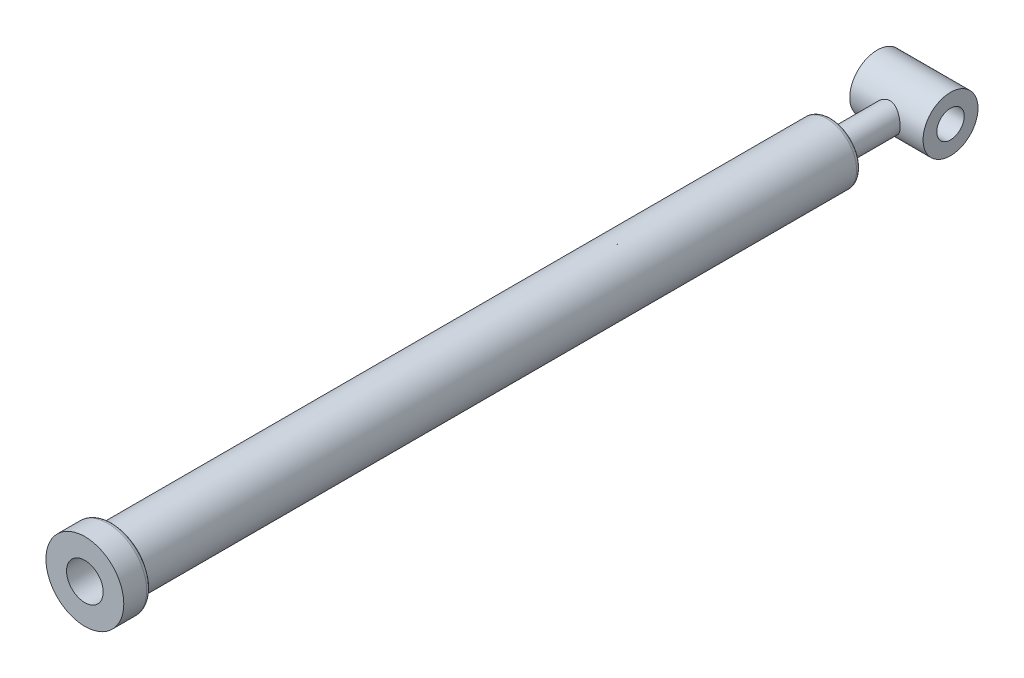
ISO-10303-21;
HEADER;
FILE_DESCRIPTION(('STEP AP214'),'2;1');
FILE_NAME('part.step','',(''),(''),'','','');
FILE_SCHEMA(('AUTOMOTIVE_DESIGN { 1 0 10303 214 1 1 1 1 }'));
ENDSEC;
DATA;
#1=APPLICATION_CONTEXT('core data for automotive mechanical design processes');
#2=APPLICATION_PROTOCOL_DEFINITION('international standard','automotive_design',2000,#1);
#3=PRODUCT_CONTEXT('',#1,'mechanical');
#4=PRODUCT('Part','Part','',(#3));
#5=PRODUCT_RELATED_PRODUCT_CATEGORY('part','',(#4));
#6=PRODUCT_DEFINITION_FORMATION('','',#4);
#7=PRODUCT_DEFINITION_CONTEXT('part definition',#1,'design');
#8=PRODUCT_DEFINITION('design','',#6,#7);
#9=PRODUCT_DEFINITION_SHAPE('','',#8);
#10=(LENGTH_UNIT() NAMED_UNIT(*) SI_UNIT(.MILLI.,.METRE.));
#11=(NAMED_UNIT(*) PLANE_ANGLE_UNIT() SI_UNIT($,.RADIAN.));
#12=(NAMED_UNIT(*) SI_UNIT($,.STERADIAN.) SOLID_ANGLE_UNIT());
#13=UNCERTAINTY_MEASURE_WITH_UNIT(LENGTH_MEASURE(1.E-05),#10,'distance_accuracy_value','');
#14=(GEOMETRIC_REPRESENTATION_CONTEXT(3) GLOBAL_UNCERTAINTY_ASSIGNED_CONTEXT((#13)) GLOBAL_UNIT_ASSIGNED_CONTEXT((#10,
#11,#12)) REPRESENTATION_CONTEXT('',''));
#15=CARTESIAN_POINT('',(0.,0.,0.));
#16=DIRECTION('',(0.,0.,1.));
#17=DIRECTION('',(1.,0.,0.));
#18=AXIS2_PLACEMENT_3D('',#15,#16,#17);
#19=CARTESIAN_POINT('',(0.,0.,-880.));
#20=DIRECTION('',(0.,0.,1.));
#21=DIRECTION('',(1.,0.,0.));
#22=AXIS2_PLACEMENT_3D('',#19,#20,#21);
#23=CYLINDRICAL_SURFACE('',#22,15.);
#24=CARTESIAN_POINT('',(0.,0.,-820.));
#25=DIRECTION('',(0.,0.,-1.));
#26=DIRECTION('',(-1.,0.,0.));
#27=AXIS2_PLACEMENT_3D('',#24,#25,#26);
#28=CIRCLE('',#27,15.);
#29=CARTESIAN_POINT('',(-15.,0.,-820.));
#30=VERTEX_POINT('',#29);
#31=EDGE_CURVE('E50',#30,#30,#28,.T.);
#32=ORIENTED_EDGE('',*,*,#31,.T.);
#33=EDGE_LOOP('',(#32));
#34=FACE_BOUND('',#33,.T.);
#35=CARTESIAN_POINT('',(15.,0.,-875.));
#36=CARTESIAN_POINT('',(14.9999986967893,-0.394466621474774,-875.000001198443));
#37=CARTESIAN_POINT('',(14.9844217290986,-0.788960822893598,-875.007798374441));
#38=CARTESIAN_POINT('',(14.9222912626951,-1.57504384672489,-875.038790696874));
#39=CARTESIAN_POINT('',(14.8757242881962,-1.96663133023565,-875.061992541911));
#40=CARTESIAN_POINT('',(14.752062134402,-2.74444839066597,-875.123245665513));
#41=CARTESIAN_POINT('',(14.674915671778,-3.13066783309047,-875.161321887591));
#42=CARTESIAN_POINT('',(14.4909926788045,-3.89427274204147,-875.251345482788));
#43=CARTESIAN_POINT('',(14.3842191117729,-4.27165908796738,-875.303291468628));
#44=CARTESIAN_POINT('',(14.1426464967422,-5.01370255233915,-875.419545464834));
#45=CARTESIAN_POINT('',(14.0079586988167,-5.37840368544458,-875.483804328683));
#46=CARTESIAN_POINT('',(13.7115835174738,-6.09447648128182,-875.623301187505));
#47=CARTESIAN_POINT('',(13.5498955527415,-6.44584785682342,-875.698539418861));
#48=CARTESIAN_POINT('',(13.2009461452605,-7.13327098283041,-875.858261390877));
#49=CARTESIAN_POINT('',(13.0136941461367,-7.4693283295993,-875.942741715132));
#50=CARTESIAN_POINT('',(12.6148696065897,-8.12479620523715,-876.119159593015));
#51=CARTESIAN_POINT('',(12.4032874777652,-8.44420009848104,-876.211100082431));
#52=CARTESIAN_POINT('',(11.9437431549207,-9.08356730455507,-876.406169485422));
#53=CARTESIAN_POINT('',(11.6943566948693,-9.40240338911198,-876.509638755958));
#54=CARTESIAN_POINT('',(11.1713323045258,-10.0182110858624,-876.720301058942));
#55=CARTESIAN_POINT('',(10.8976929878613,-10.3151814463611,-876.827494304051));
#56=CARTESIAN_POINT('',(10.32744213221,-10.8860835918351,-877.043134053405));
#57=CARTESIAN_POINT('',(10.0308163772597,-11.1600008976787,-877.151581297343));
#58=CARTESIAN_POINT('',(9.41609706949255,-11.6833254232374,-877.367048472574));
#59=CARTESIAN_POINT('',(9.09799950074795,-11.9327280363632,-877.474068132354));
#60=CARTESIAN_POINT('',(8.41621019135655,-12.424066666325,-877.692119687857));
#61=CARTESIAN_POINT('',(8.05089693128164,-12.6639084928373,-877.802814953086));
#62=CARTESIAN_POINT('',(7.29906225682786,-13.1116371457317,-878.01581142987));
#63=CARTESIAN_POINT('',(6.91254992484988,-13.3195375140209,-878.118116190041));
#64=CARTESIAN_POINT('',(6.12045119528939,-13.7015816677248,-878.310817756053));
#65=CARTESIAN_POINT('',(5.71487061752195,-13.8757356708103,-878.40121816361));
#66=CARTESIAN_POINT('',(4.88717106989482,-14.1884178363296,-878.566685065391));
#67=CARTESIAN_POINT('',(4.46505393858207,-14.3269499463523,-878.641753258529));
#68=CARTESIAN_POINT('',(3.63312743966091,-14.5593818816456,-878.769465636118));
#69=CARTESIAN_POINT('',(3.22409061692207,-14.6554546162323,-878.823181991672));
#70=CARTESIAN_POINT('',(2.3974253026042,-14.8131483158836,-878.912093372582));
#71=CARTESIAN_POINT('',(1.97979717934038,-14.874770754679,-878.947289190215));
#72=CARTESIAN_POINT('',(1.1399780978413,-14.9625716596024,-878.997615020556));
#73=CARTESIAN_POINT('',(0.717791304375857,-14.9887801055065,-879.012762005415));
#74=CARTESIAN_POINT('',(-0.127503752153197,-15.0054120092055,-879.022361014937));
#75=CARTESIAN_POINT('',(-0.550611923450829,-14.9958388811994,-879.016815014078));
#76=CARTESIAN_POINT('',(-1.34318604493256,-14.9443693637688,-878.987185469988));
#77=CARTESIAN_POINT('',(-1.7130074967434,-14.9064815133301,-878.965401642622));
#78=CARTESIAN_POINT('',(-2.44761394651885,-14.8036048078167,-878.90676729953));
#79=CARTESIAN_POINT('',(-2.81239941379462,-14.7386184959446,-878.869918197694));
#80=CARTESIAN_POINT('',(-3.53465011425935,-14.5822778462236,-878.782349877417));
#81=CARTESIAN_POINT('',(-3.8921134894694,-14.490916902454,-878.731627184297));
#82=CARTESIAN_POINT('',(-4.5975509702241,-14.2827793732036,-878.617879915435));
#83=CARTESIAN_POINT('',(-4.94552456919406,-14.1660014339124,-878.554854684428));
#84=CARTESIAN_POINT('',(-5.63806138553526,-13.9051185945145,-878.416735657268));
#85=CARTESIAN_POINT('',(-5.98236177926314,-13.7604466030275,-878.341397479624));
#86=CARTESIAN_POINT('',(-6.65764881287019,-13.4467240006949,-878.181786349803));
#87=CARTESIAN_POINT('',(-6.9886306367092,-13.2776646708395,-878.097510204973));
#88=CARTESIAN_POINT('',(-7.63583954119808,-12.9163207460711,-877.922168121219));
#89=CARTESIAN_POINT('',(-7.95206429387355,-12.724032503779,-877.831101116863));
#90=CARTESIAN_POINT('',(-8.56852275615349,-12.3173373374607,-877.644319137144));
#91=CARTESIAN_POINT('',(-8.86875518007752,-12.1029286391493,-877.548603789262));
#92=CARTESIAN_POINT('',(-9.48921356105551,-11.6244221009996,-877.342288154575));
#93=CARTESIAN_POINT('',(-9.80713018813409,-11.357472454083,-877.23134228918));
#94=CARTESIAN_POINT('',(-10.4195910602954,-10.7983337273758,-877.009171948651));
#95=CARTESIAN_POINT('',(-10.7141433900476,-10.5061534517949,-876.897947583749));
#96=CARTESIAN_POINT('',(-11.2787205781467,-9.89761910582897,-876.677890344788));
#97=CARTESIAN_POINT('',(-11.5487236024523,-9.58124396820905,-876.569059663621));
#98=CARTESIAN_POINT('',(-12.0621805278786,-8.92619254193717,-876.356648454252));
#99=CARTESIAN_POINT('',(-12.3056450163623,-8.58752523371366,-876.253065841263));
#100=CARTESIAN_POINT('',(-12.7751937974681,-7.87309152384946,-876.049027950798));
#101=CARTESIAN_POINT('',(-12.999931268877,-7.49633062281164,-875.94894596163));
#102=CARTESIAN_POINT('',(-13.4165538554255,-6.72229496746225,-875.760139769321));
#103=CARTESIAN_POINT('',(-13.608437440683,-6.32501925897374,-875.671416095143));
#104=CARTESIAN_POINT('',(-13.9571914545699,-5.51289034160744,-875.507976152198));
#105=CARTESIAN_POINT('',(-14.1140841452216,-5.09804850978522,-875.433250982128));
#106=CARTESIAN_POINT('',(-14.391076168471,-4.25373396764104,-875.300028469866));
#107=CARTESIAN_POINT('',(-14.5111797336915,-3.82426294674312,-875.241529260936));
#108=CARTESIAN_POINT('',(-14.7045987917793,-2.99040123124789,-875.146713024642));
#109=CARTESIAN_POINT('',(-14.780965864728,-2.58687987737183,-875.108959937918));
#110=CARTESIAN_POINT('',(-14.9004227368483,-1.77375891598894,-875.049709617986));
#111=CARTESIAN_POINT('',(-14.9435143460633,-1.36415964033065,-875.028211500579));
#112=CARTESIAN_POINT('',(-14.9958394822899,-0.542432179601619,-875.002088586177));
#113=CARTESIAN_POINT('',(-15.0050865466642,-0.130305071717037,-874.997457042783));
#114=CARTESIAN_POINT('',(-14.9896332143828,0.693142933067775,-875.005182902425));
#115=CARTESIAN_POINT('',(-14.9649343201033,1.10446386484084,-875.017539553599));
#116=CARTESIAN_POINT('',(-14.8851569218173,1.89104365716466,-875.057274299687));
#117=CARTESIAN_POINT('',(-14.8325856924447,2.26662317638414,-875.083411784036));
#118=CARTESIAN_POINT('',(-14.6994449555599,3.01155508953995,-875.149198828482));
#119=CARTESIAN_POINT('',(-14.6188772495211,3.38090788254089,-875.188847519177));
#120=CARTESIAN_POINT('',(-14.4305792041858,4.11102643115709,-875.280732355606));
#121=CARTESIAN_POINT('',(-14.322847354219,4.47179170797618,-875.332969201392));
#122=CARTESIAN_POINT('',(-14.0812572947496,5.18257720416893,-875.448848110263));
#123=CARTESIAN_POINT('',(-13.9473979874992,5.53259697135359,-875.512490652549));
#124=CARTESIAN_POINT('',(-13.6505393721982,6.22979935488015,-875.651753782206));
#125=CARTESIAN_POINT('',(-13.4868176517073,6.576616120173,-875.727664302393));
#126=CARTESIAN_POINT('',(-13.1343016754682,7.25508680349727,-875.88839960015));
#127=CARTESIAN_POINT('',(-12.9455071994249,7.58674058826881,-875.973224456043));
#128=CARTESIAN_POINT('',(-12.5441531585986,8.23341158684491,-876.149985850757));
#129=CARTESIAN_POINT('',(-12.3315897999932,8.54842613296244,-876.241923524154));
#130=CARTESIAN_POINT('',(-11.8839483671782,9.16054648853287,-876.431012285166));
#131=CARTESIAN_POINT('',(-11.6488615394066,9.45764526147817,-876.528165393215));
#132=CARTESIAN_POINT('',(-11.1333715012893,10.060839107335,-876.735341464201));
#133=CARTESIAN_POINT('',(-10.8507851186195,10.3649587307601,-876.845692143983));
#134=CARTESIAN_POINT('',(-10.2616154855625,10.9485707923032,-877.06746929941));
#135=CARTESIAN_POINT('',(-9.9550311697726,11.2280621358615,-877.178895822626));
#136=CARTESIAN_POINT('',(-9.31919419442999,11.761157874002,-877.400027289832));
#137=CARTESIAN_POINT('',(-8.98992792709478,12.0147464980315,-877.50973115101));
#138=CARTESIAN_POINT('',(-8.31037887445767,12.4944228999317,-877.724397948994));
#139=CARTESIAN_POINT('',(-7.96009249191951,12.7205059505332,-877.829360068912));
#140=CARTESIAN_POINT('',(-7.22261605950783,13.1539172060939,-878.036414537209));
#141=CARTESIAN_POINT('',(-6.83445930863627,13.3597919511091,-878.138116937488));
#142=CARTESIAN_POINT('',(-6.03927850598328,13.737567232961,-878.329340387484));
#143=CARTESIAN_POINT('',(-5.63226376216402,13.9094843147169,-878.418867362678));
#144=CARTESIAN_POINT('',(-4.80217565091482,14.2174151642657,-878.582288068273));
#145=CARTESIAN_POINT('',(-4.37911544662186,14.353457663537,-878.656194299646));
#146=CARTESIAN_POINT('',(-3.51992505793521,14.5879514095295,-878.78531598748));
#147=CARTESIAN_POINT('',(-3.08379690851378,14.6864084766722,-878.840534337767));
#148=CARTESIAN_POINT('',(-2.24471283239244,14.8366134509912,-878.925460869571));
#149=CARTESIAN_POINT('',(-1.84259137531863,14.8919378625023,-878.957109030588));
#150=CARTESIAN_POINT('',(-1.0341590037221,14.9698153891526,-879.0017947784));
#151=CARTESIAN_POINT('',(-0.627848376009428,14.9923707330054,-879.014833630864));
#152=CARTESIAN_POINT('',(0.185270351507968,15.0043645010929,-879.021757365319));
#153=CARTESIAN_POINT('',(0.592078211651152,14.9938151743778,-879.015649331845));
#154=CARTESIAN_POINT('',(1.40275816467971,14.9397884815991,-878.984549012312));
#155=CARTESIAN_POINT('',(1.80663037706581,14.8963124635393,-878.959557499333));
#156=CARTESIAN_POINT('',(2.56967168244059,14.782795841076,-878.894967278986));
#157=CARTESIAN_POINT('',(2.92942204471818,14.7156934571528,-878.856994150101));
#158=CARTESIAN_POINT('',(3.64159381579529,14.5558242789108,-878.767646667704));
#159=CARTESIAN_POINT('',(3.99401275857395,14.4630489945772,-878.716267881271));
#160=CARTESIAN_POINT('',(4.68939648000362,14.2527724980854,-878.601651711384));
#161=CARTESIAN_POINT('',(5.0323611460618,14.1352709916016,-878.538414186773));
#162=CARTESIAN_POINT('',(5.70716431681701,13.8765585244577,-878.401832636467));
#163=CARTESIAN_POINT('',(6.0390017228925,13.7353452308956,-878.328487616466));
#164=CARTESIAN_POINT('',(6.71194905721808,13.4200195538921,-878.16836954442));
#165=CARTESIAN_POINT('',(7.05218633738287,13.2443351386714,-878.081025622915));
#166=CARTESIAN_POINT('',(7.71683729888767,12.8684192321827,-877.899310742732));
#167=CARTESIAN_POINT('',(8.04125049766908,12.6681869929773,-877.804939569978));
#168=CARTESIAN_POINT('',(8.67307599887717,12.2442855818538,-877.611466647555));
#169=CARTESIAN_POINT('',(8.9804818359264,12.0206075892618,-877.512363125188));
#170=CARTESIAN_POINT('',(9.57700095794095,11.5509819278367,-877.311734819274));
#171=CARTESIAN_POINT('',(9.86611149224955,11.3050309237573,-877.210209674785));
#172=CARTESIAN_POINT('',(10.4588881043877,10.7607009160988,-876.994588016576));
#173=CARTESIAN_POINT('',(10.7600384098886,10.4595848725634,-876.880466375821));
#174=CARTESIAN_POINT('',(11.3360350079751,9.83237263592984,-876.655062843985));
#175=CARTESIAN_POINT('',(11.6108894699081,9.50628425805799,-876.543780078878));
#176=CARTESIAN_POINT('',(12.1328673274452,8.83040064495091,-876.326840554529));
#177=CARTESIAN_POINT('',(12.3799686513199,8.48058689086185,-876.221188307768));
#178=CARTESIAN_POINT('',(12.8443186951047,7.75934315416603,-876.018404213272));
#179=CARTESIAN_POINT('',(13.0615691351246,7.38791441884538,-875.921271874707));
#180=CARTESIAN_POINT('',(13.4657554418474,6.62283359834588,-875.737499586337));
#181=CARTESIAN_POINT('',(13.652463307469,6.22904153096558,-875.650939674485));
#182=CARTESIAN_POINT('',(13.9917304392215,5.42422205013374,-875.491593102566));
#183=CARTESIAN_POINT('',(14.1442848128173,5.01319217734313,-875.418808416049));
#184=CARTESIAN_POINT('',(14.4130312534336,4.17809175418138,-875.289368363161));
#185=CARTESIAN_POINT('',(14.52931393542,3.75405665560561,-875.232672834932));
#186=CARTESIAN_POINT('',(14.7244141315277,2.89570983328148,-875.136960690795));
#187=CARTESIAN_POINT('',(14.8032545313493,2.46140455781254,-875.097933276359));
#188=CARTESIAN_POINT('',(14.9084233559045,1.68912528485808,-875.04570850057));
#189=CARTESIAN_POINT('',(14.9427351996439,1.35247752005866,-875.028597786956));
#190=CARTESIAN_POINT('',(14.9885243961843,0.67722664728,-875.005742865413));
#191=CARTESIAN_POINT('',(15.0000011187201,0.338623485589112,-874.999998971216));
#192=CARTESIAN_POINT('',(15.,0.,-875.));
#193=B_SPLINE_CURVE_WITH_KNOTS('',3,(#35,#36,#37,#38,#39,#40,#41,#42,#43,#44,#45,#46,#47,#48,
#49,#50,#51,#52,#53,#54,#55,#56,#57,#58,#59,#60,#61,#62,#63,#64,#65,#66,#67,#68,#69,#70,#71,#72,
#73,#74,#75,#76,#77,#78,#79,#80,#81,#82,#83,#84,#85,#86,#87,#88,#89,#90,#91,#92,#93,#94,#95,#96,
#97,#98,#99,#100,#101,#102,#103,#104,#105,#106,#107,#108,#109,#110,#111,#112,#113,#114,#115,
#116,#117,#118,#119,#120,#121,#122,#123,#124,#125,#126,#127,#128,#129,#130,#131,#132,#133,#134,
#135,#136,#137,#138,#139,#140,#141,#142,#143,#144,#145,#146,#147,#148,#149,#150,#151,#152,#153,
#154,#155,#156,#157,#158,#159,#160,#161,#162,#163,#164,#165,#166,#167,#168,#169,#170,#171,#172,
#173,#174,#175,#176,#177,#178,#179,#180,#181,#182,#183,#184,#185,#186,#187,#188,#189,#190,#191,
#192),.UNSPECIFIED.,.T.,.F.,(4,2,2,2,2,2,2,2,2,2,2,2,2,2,2,2,2,2,2,2,2,2,2,2,2,2,2,2,2,2,2,2,2,
2,2,2,2,2,2,2,2,2,2,2,2,2,2,2,2,2,2,2,2,2,2,2,2,2,2,2,2,2,2,2,2,2,2,2,2,2,2,2,2,2,2,2,2,2,4),
(0.,1.1830658838765,2.36664655205927,3.55222059958419,4.73767610811696,5.91849492154762,
7.09933916134024,8.27974835920213,9.46062435602728,10.7126941080732,11.9648354787241,
13.2177575130875,14.4709145374422,15.821667201721,17.1718456109054,18.521614574237,
19.8712338927467,21.1401798733571,22.4090715662491,23.6768884023223,24.9445842691984,
26.0604534443427,27.1762179182402,28.2922620948529,29.4083657309785,30.550157382565,
31.6923582661887,32.8347387306652,33.9772108970053,35.2649000045823,36.5521415758273,
37.8405170382692,39.1283766165387,40.4765138704575,41.824713885002,43.1720536807209,
44.519238405488,45.7548292237563,46.9903528264139,48.2253821822106,49.4603568799793,
50.5994583371908,51.7384865108584,52.8775780428886,54.0167174442702,55.1883567290371,
56.3600063087792,57.5318431666801,58.7041373111916,59.9914055352965,61.2787309408957,
62.5668355046821,63.8551611378706,65.2063513889893,66.5568816778175,67.9063270370393,
69.2555633384068,70.4752824018563,71.6949185050053,72.9141033841497,74.1332383531126,
75.2357784731185,76.3386836391977,77.4416019343193,78.5446288045349,79.7216927437009,
80.8987925552603,82.0763368112874,83.2540576898123,84.5752168212047,85.8959641652359,
87.217754555028,88.5394687467831,89.8706389488175,91.2019997209938,92.5300073067729,
93.8572021316087,94.872757858524,95.8883416150965),.UNSPECIFIED.);
#194=CARTESIAN_POINT('',(15.,0.,-875.));
#195=VERTEX_POINT('',#194);
#196=EDGE_CURVE('E73',#195,#195,#193,.T.);
#197=ORIENTED_EDGE('',*,*,#196,.F.);
#198=EDGE_LOOP('',(#197));
#199=FACE_BOUND('',#198,.T.);
#200=ADVANCED_FACE('F41',(#34,#199),#23,.T.);
#201=CARTESIAN_POINT('',(0.,0.,-30.));
#202=DIRECTION('',(0.,0.,1.));
#203=DIRECTION('',(1.,0.,0.));
#204=AXIS2_PLACEMENT_3D('',#201,#202,#203);
#205=CYLINDRICAL_SURFACE('',#204,42.5);
#206=CARTESIAN_POINT('',(0.,0.,-25.));
#207=DIRECTION('',(0.,0.,1.));
#208=DIRECTION('',(1.,0.,0.));
#209=AXIS2_PLACEMENT_3D('',#206,#207,#208);
#210=CIRCLE('',#209,42.5);
#211=CARTESIAN_POINT('',(42.5,0.,-25.));
#212=VERTEX_POINT('',#211);
#213=EDGE_CURVE('E10',#212,#212,#210,.T.);
#214=ORIENTED_EDGE('',*,*,#213,.T.);
#215=EDGE_LOOP('',(#214));
#216=FACE_BOUND('',#215,.T.);
#217=CARTESIAN_POINT('',(0.,0.,0.));
#218=DIRECTION('',(0.,0.,1.));
#219=DIRECTION('',(1.,0.,0.));
#220=AXIS2_PLACEMENT_3D('',#217,#218,#219);
#221=CIRCLE('',#220,42.5);
#222=CARTESIAN_POINT('',(42.5,0.,0.));
#223=VERTEX_POINT('',#222);
#224=EDGE_CURVE('E82',#223,#223,#221,.T.);
#225=ORIENTED_EDGE('',*,*,#224,.F.);
#226=EDGE_LOOP('',(#225));
#227=FACE_BOUND('',#226,.T.);
#228=ADVANCED_FACE('F113',(#216,#227),#205,.T.);
#229=CARTESIAN_POINT('',(0.,0.,0.));
#230=DIRECTION('',(0.,0.,1.));
#231=DIRECTION('',(1.,0.,0.));
#232=AXIS2_PLACEMENT_3D('',#229,#230,#231);
#233=PLANE('',#232);
#234=CARTESIAN_POINT('',(0.,0.,0.));
#235=DIRECTION('',(0.,0.,1.));
#236=DIRECTION('',(1.,0.,0.));
#237=AXIS2_PLACEMENT_3D('',#234,#235,#236);
#238=CIRCLE('',#237,20.);
#239=CARTESIAN_POINT('',(20.,0.,0.));
#240=VERTEX_POINT('',#239);
#241=EDGE_CURVE('E165',#240,#240,#238,.T.);
#242=ORIENTED_EDGE('',*,*,#241,.F.);
#243=EDGE_LOOP('',(#242));
#244=FACE_BOUND('',#243,.T.);
#245=ORIENTED_EDGE('',*,*,#224,.T.);
#246=EDGE_LOOP('',(#245));
#247=FACE_BOUND('',#246,.T.);
#248=ADVANCED_FACE('F118',(#244,#247),#233,.T.);
#249=CARTESIAN_POINT('',(0.,0.,-30.));
#250=DIRECTION('',(0.,0.,1.));
#251=DIRECTION('',(1.,0.,0.));
#252=AXIS2_PLACEMENT_3D('',#249,#250,#251);
#253=CYLINDRICAL_SURFACE('',#252,20.);
#254=ORIENTED_EDGE('',*,*,#241,.T.);
#255=EDGE_LOOP('',(#254));
#256=FACE_BOUND('',#255,.T.);
#257=CARTESIAN_POINT('',(0.,0.,-810.));
#258=DIRECTION('',(0.,0.,-1.));
#259=DIRECTION('',(-1.,0.,0.));
#260=AXIS2_PLACEMENT_3D('',#257,#258,#259);
#261=CIRCLE('',#260,20.);
#262=CARTESIAN_POINT('',(-20.,0.,-810.));
#263=VERTEX_POINT('',#262);
#264=EDGE_CURVE('E171',#263,#263,#261,.T.);
#265=ORIENTED_EDGE('',*,*,#264,.T.);
#266=EDGE_LOOP('',(#265));
#267=FACE_BOUND('',#266,.T.);
#268=ADVANCED_FACE('F146',(#256,#267),#253,.F.);
#269=CARTESIAN_POINT('',(0.,0.,-810.));
#270=DIRECTION('',(0.,0.,1.));
#271=DIRECTION('',(1.,0.,0.));
#272=AXIS2_PLACEMENT_3D('',#269,#270,#271);
#273=CYLINDRICAL_SURFACE('',#272,32.5);
#274=CARTESIAN_POINT('',(0.,0.,-810.));
#275=DIRECTION('',(0.,0.,-1.));
#276=DIRECTION('',(-1.,0.,0.));
#277=AXIS2_PLACEMENT_3D('',#274,#275,#276);
#278=CIRCLE('',#277,32.5);
#279=CARTESIAN_POINT('',(-32.5,0.,-810.));
#280=VERTEX_POINT('',#279);
#281=EDGE_CURVE('E55',#280,#280,#278,.F.);
#282=ORIENTED_EDGE('',*,*,#281,.T.);
#283=EDGE_LOOP('',(#282));
#284=FACE_BOUND('',#283,.T.);
#285=CARTESIAN_POINT('',(0.,0.,-35.));
#286=DIRECTION('',(0.,0.,1.));
#287=DIRECTION('',(1.,0.,0.));
#288=AXIS2_PLACEMENT_3D('',#285,#286,#287);
#289=CIRCLE('',#288,32.5);
#290=CARTESIAN_POINT('',(32.5,0.,-35.));
#291=VERTEX_POINT('',#290);
#292=EDGE_CURVE('E61',#291,#291,#289,.F.);
#293=ORIENTED_EDGE('',*,*,#292,.T.);
#294=EDGE_LOOP('',(#293));
#295=FACE_BOUND('',#294,.T.);
#296=ADVANCED_FACE('F143',(#284,#295),#273,.T.);
#297=CARTESIAN_POINT('',(0.,0.,-810.));
#298=DIRECTION('',(0.,0.,-1.));
#299=DIRECTION('',(-1.,0.,0.));
#300=AXIS2_PLACEMENT_3D('',#297,#298,#299);
#301=PLANE('',#300);
#302=ORIENTED_EDGE('',*,*,#264,.F.);
#303=EDGE_LOOP('',(#302));
#304=FACE_BOUND('',#303,.T.);
#305=ADVANCED_FACE('F145',(#304),#301,.F.);
#306=CARTESIAN_POINT('',(0.,0.,-815.));
#307=DIRECTION('',(0.,0.,-1.));
#308=DIRECTION('',(-1.,0.,0.));
#309=AXIS2_PLACEMENT_3D('',#306,#307,#308);
#310=PLANE('',#309);
#311=CARTESIAN_POINT('',(0.,0.,-815.));
#312=DIRECTION('',(0.,0.,-1.));
#313=DIRECTION('',(-1.,0.,0.));
#314=AXIS2_PLACEMENT_3D('',#311,#312,#313);
#315=CIRCLE('',#314,27.5);
#316=CARTESIAN_POINT('',(-27.5,0.,-815.));
#317=VERTEX_POINT('',#316);
#318=EDGE_CURVE('E65',#317,#317,#315,.T.);
#319=ORIENTED_EDGE('',*,*,#318,.T.);
#320=EDGE_LOOP('',(#319));
#321=FACE_BOUND('',#320,.T.);
#322=CARTESIAN_POINT('',(0.,0.,-815.));
#323=DIRECTION('',(0.,0.,-1.));
#324=DIRECTION('',(-1.,0.,0.));
#325=AXIS2_PLACEMENT_3D('',#322,#323,#324);
#326=CIRCLE('',#325,20.);
#327=CARTESIAN_POINT('',(-20.,0.,-815.));
#328=VERTEX_POINT('',#327);
#329=EDGE_CURVE('E69',#328,#328,#326,.F.);
#330=ORIENTED_EDGE('',*,*,#329,.T.);
#331=EDGE_LOOP('',(#330));
#332=FACE_BOUND('',#331,.T.);
#333=ADVANCED_FACE('F91',(#321,#332),#310,.T.);
#334=CARTESIAN_POINT('',(40.,0.,-905.));
#335=DIRECTION('',(-1.,0.,0.));
#336=DIRECTION('',(0.,0.,1.));
#337=AXIS2_PLACEMENT_3D('',#334,#335,#336);
#338=CYLINDRICAL_SURFACE('',#337,30.);
#339=CARTESIAN_POINT('',(-40.,0.,-905.));
#340=DIRECTION('',(1.,0.,0.));
#341=DIRECTION('',(0.,0.,-1.));
#342=AXIS2_PLACEMENT_3D('',#339,#340,#341);
#343=CIRCLE('',#342,30.);
#344=CARTESIAN_POINT('',(-40.,0.,-935.));
#345=VERTEX_POINT('',#344);
#346=EDGE_CURVE('E177',#345,#345,#343,.T.);
#347=ORIENTED_EDGE('',*,*,#346,.T.);
#348=EDGE_LOOP('',(#347));
#349=FACE_BOUND('',#348,.T.);
#350=CARTESIAN_POINT('',(40.,0.,-905.));
#351=DIRECTION('',(1.,0.,0.));
#352=DIRECTION('',(0.,0.,-1.));
#353=AXIS2_PLACEMENT_3D('',#350,#351,#352);
#354=CIRCLE('',#353,30.);
#355=CARTESIAN_POINT('',(40.,0.,-935.));
#356=VERTEX_POINT('',#355);
#357=EDGE_CURVE('E174',#356,#356,#354,.T.);
#358=ORIENTED_EDGE('',*,*,#357,.F.);
#359=EDGE_LOOP('',(#358));
#360=FACE_BOUND('',#359,.T.);
#361=ORIENTED_EDGE('',*,*,#196,.T.);
#362=EDGE_LOOP('',(#361));
#363=FACE_BOUND('',#362,.T.);
#364=ADVANCED_FACE('F86',(#349,#360,#363),#338,.T.);
#365=CARTESIAN_POINT('',(40.,0.,-905.));
#366=DIRECTION('',(1.,0.,0.));
#367=DIRECTION('',(0.,0.,-1.));
#368=AXIS2_PLACEMENT_3D('',#365,#366,#367);
#369=PLANE('',#368);
#370=ORIENTED_EDGE('',*,*,#357,.T.);
#371=EDGE_LOOP('',(#370));
#372=FACE_BOUND('',#371,.T.);
#373=CARTESIAN_POINT('',(40.,0.,-905.));
#374=DIRECTION('',(1.,0.,0.));
#375=DIRECTION('',(0.,0.,-1.));
#376=AXIS2_PLACEMENT_3D('',#373,#374,#375);
#377=CIRCLE('',#376,15.);
#378=CARTESIAN_POINT('',(40.,0.,-920.));
#379=VERTEX_POINT('',#378);
#380=EDGE_CURVE('E181',#379,#379,#377,.T.);
#381=ORIENTED_EDGE('',*,*,#380,.F.);
#382=EDGE_LOOP('',(#381));
#383=FACE_BOUND('',#382,.T.);
#384=ADVANCED_FACE('F90',(#372,#383),#369,.T.);
#385=CARTESIAN_POINT('',(-40.,0.,-905.));
#386=DIRECTION('',(1.,0.,0.));
#387=DIRECTION('',(0.,0.,-1.));
#388=AXIS2_PLACEMENT_3D('',#385,#386,#387);
#389=PLANE('',#388);
#390=ORIENTED_EDGE('',*,*,#346,.F.);
#391=EDGE_LOOP('',(#390));
#392=FACE_BOUND('',#391,.T.);
#393=CARTESIAN_POINT('',(-40.,0.,-905.));
#394=DIRECTION('',(1.,0.,0.));
#395=DIRECTION('',(0.,0.,-1.));
#396=AXIS2_PLACEMENT_3D('',#393,#394,#395);
#397=CIRCLE('',#396,15.);
#398=CARTESIAN_POINT('',(-40.,0.,-920.));
#399=VERTEX_POINT('',#398);
#400=EDGE_CURVE('E185',#399,#399,#397,.T.);
#401=ORIENTED_EDGE('',*,*,#400,.T.);
#402=EDGE_LOOP('',(#401));
#403=FACE_BOUND('',#402,.T.);
#404=ADVANCED_FACE('F93',(#392,#403),#389,.F.);
#405=CARTESIAN_POINT('',(40.,0.,-905.));
#406=DIRECTION('',(-1.,0.,0.));
#407=DIRECTION('',(0.,0.,1.));
#408=AXIS2_PLACEMENT_3D('',#405,#406,#407);
#409=CYLINDRICAL_SURFACE('',#408,15.);
#410=ORIENTED_EDGE('',*,*,#380,.T.);
#411=EDGE_LOOP('',(#410));
#412=FACE_BOUND('',#411,.T.);
#413=ORIENTED_EDGE('',*,*,#400,.F.);
#414=EDGE_LOOP('',(#413));
#415=FACE_BOUND('',#414,.T.);
#416=ADVANCED_FACE('F96',(#412,#415),#409,.F.);
#417=CARTESIAN_POINT('',(0.,0.,-810.));
#418=DIRECTION('',(0.,0.,-1.));
#419=DIRECTION('',(-1.,0.,0.));
#420=AXIS2_PLACEMENT_3D('',#417,#418,#419);
#421=TOROIDAL_SURFACE('',#420,27.5,5.);
#422=ORIENTED_EDGE('',*,*,#281,.F.);
#423=EDGE_LOOP('',(#422));
#424=FACE_BOUND('',#423,.T.);
#425=ORIENTED_EDGE('',*,*,#318,.F.);
#426=EDGE_LOOP('',(#425));
#427=FACE_BOUND('',#426,.T.);
#428=ADVANCED_FACE('F102',(#424,#427),#421,.T.);
#429=CARTESIAN_POINT('',(0.,0.,-820.));
#430=DIRECTION('',(0.,0.,-1.));
#431=DIRECTION('',(-1.,0.,0.));
#432=AXIS2_PLACEMENT_3D('',#429,#430,#431);
#433=TOROIDAL_SURFACE('',#432,20.,5.);
#434=ORIENTED_EDGE('',*,*,#329,.F.);
#435=EDGE_LOOP('',(#434));
#436=FACE_BOUND('',#435,.T.);
#437=ORIENTED_EDGE('',*,*,#31,.F.);
#438=EDGE_LOOP('',(#437));
#439=FACE_BOUND('',#438,.T.);
#440=ADVANCED_FACE('F107',(#436,#439),#433,.F.);
#441=CARTESIAN_POINT('',(0.,0.,-25.));
#442=DIRECTION('',(0.,0.,1.));
#443=DIRECTION('',(1.,0.,0.));
#444=AXIS2_PLACEMENT_3D('',#441,#442,#443);
#445=TOROIDAL_SURFACE('',#444,37.5,5.);
#446=ORIENTED_EDGE('',*,*,#213,.F.);
#447=EDGE_LOOP('',(#446));
#448=FACE_BOUND('',#447,.T.);
#449=CARTESIAN_POINT('',(0.,0.,-30.));
#450=DIRECTION('',(0.,0.,1.));
#451=DIRECTION('',(1.,0.,0.));
#452=AXIS2_PLACEMENT_3D('',#449,#450,#451);
#453=CIRCLE('',#452,37.5);
#454=CARTESIAN_POINT('',(37.5,0.,-30.));
#455=VERTEX_POINT('',#454);
#456=EDGE_CURVE('E45',#455,#455,#453,.F.);
#457=ORIENTED_EDGE('',*,*,#456,.F.);
#458=EDGE_LOOP('',(#457));
#459=FACE_BOUND('',#458,.T.);
#460=ADVANCED_FACE('F43',(#448,#459),#445,.T.);
#461=CARTESIAN_POINT('',(0.,0.,-35.));
#462=DIRECTION('',(0.,0.,1.));
#463=DIRECTION('',(1.,0.,0.));
#464=AXIS2_PLACEMENT_3D('',#461,#462,#463);
#465=TOROIDAL_SURFACE('',#464,37.5,5.);
#466=ORIENTED_EDGE('',*,*,#456,.T.);
#467=EDGE_LOOP('',(#466));
#468=FACE_BOUND('',#467,.T.);
#469=ORIENTED_EDGE('',*,*,#292,.F.);
#470=EDGE_LOOP('',(#469));
#471=FACE_BOUND('',#470,.T.);
#472=ADVANCED_FACE('F131',(#468,#471),#465,.F.);
#473=CLOSED_SHELL('',(#200,#228,#248,#268,#296,#305,#333,#364,#384,#404,#416,#428,#440,#460,#472));
#474=MANIFOLD_SOLID_BREP('B2',#473);
#475=ADVANCED_BREP_SHAPE_REPRESENTATION('',(#18,#474),#14);
#476=SHAPE_DEFINITION_REPRESENTATION(#9,#475);
ENDSEC;
END-ISO-10303-21;
